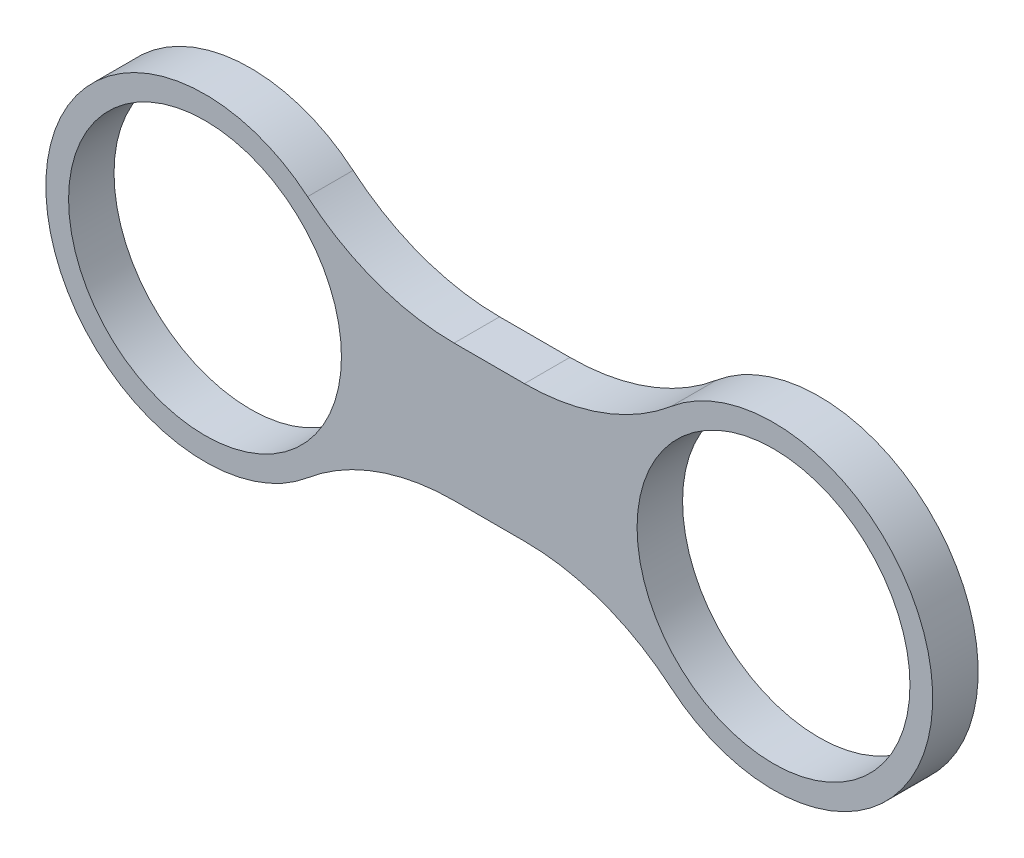
ISO-10303-21;
HEADER;
FILE_DESCRIPTION(('STEP AP214'),'2;1');
FILE_NAME('part.step','',(''),(''),'','','');
FILE_SCHEMA(('AUTOMOTIVE_DESIGN { 1 0 10303 214 1 1 1 1 }'));
ENDSEC;
DATA;
#1=APPLICATION_CONTEXT('core data for automotive mechanical design processes');
#2=APPLICATION_PROTOCOL_DEFINITION('international standard','automotive_design',2000,#1);
#3=PRODUCT_CONTEXT('',#1,'mechanical');
#4=PRODUCT('Part','Part','',(#3));
#5=PRODUCT_RELATED_PRODUCT_CATEGORY('part','',(#4));
#6=PRODUCT_DEFINITION_FORMATION('','',#4);
#7=PRODUCT_DEFINITION_CONTEXT('part definition',#1,'design');
#8=PRODUCT_DEFINITION('design','',#6,#7);
#9=PRODUCT_DEFINITION_SHAPE('','',#8);
#10=(LENGTH_UNIT() NAMED_UNIT(*) SI_UNIT(.MILLI.,.METRE.));
#11=(NAMED_UNIT(*) PLANE_ANGLE_UNIT() SI_UNIT($,.RADIAN.));
#12=(NAMED_UNIT(*) SI_UNIT($,.STERADIAN.) SOLID_ANGLE_UNIT());
#13=UNCERTAINTY_MEASURE_WITH_UNIT(LENGTH_MEASURE(1.E-05),#10,'distance_accuracy_value','');
#14=(GEOMETRIC_REPRESENTATION_CONTEXT(3) GLOBAL_UNCERTAINTY_ASSIGNED_CONTEXT((#13)) GLOBAL_UNIT_ASSIGNED_CONTEXT((#10,
#11,#12)) REPRESENTATION_CONTEXT('',''));
#15=CARTESIAN_POINT('',(0.,0.,0.));
#16=DIRECTION('',(0.,0.,1.));
#17=DIRECTION('',(1.,0.,0.));
#18=AXIS2_PLACEMENT_3D('',#15,#16,#17);
#19=CARTESIAN_POINT('',(-12.5,0.,2.));
#20=DIRECTION('',(0.,0.,-1.));
#21=DIRECTION('',(-1.,0.,0.));
#22=AXIS2_PLACEMENT_3D('',#19,#20,#21);
#23=CYLINDRICAL_SURFACE('',#22,7.);
#24=CARTESIAN_POINT('',(-12.5,0.,0.));
#25=DIRECTION('',(0.,0.,1.));
#26=DIRECTION('',(1.,0.,0.));
#27=AXIS2_PLACEMENT_3D('',#24,#25,#26);
#28=CIRCLE('',#27,7.);
#29=CARTESIAN_POINT('',(-7.9893436440751,5.35294117647059,0.));
#30=VERTEX_POINT('',#29);
#31=CARTESIAN_POINT('',(-7.9893436440751,-5.35294117647059,0.));
#32=VERTEX_POINT('',#31);
#33=EDGE_CURVE('E112',#30,#32,#28,.T.);
#34=ORIENTED_EDGE('',*,*,#33,.T.);
#35=DIRECTION('',(0.,0.,-1.));
#36=VECTOR('',#35,1.);
#37=CARTESIAN_POINT('',(-7.9893436440751,-5.35294117647059,2.));
#38=LINE('',#37,#36);
#39=CARTESIAN_POINT('',(-7.9893436440751,-5.35294117647059,2.));
#40=VERTEX_POINT('',#39);
#41=EDGE_CURVE('E58',#32,#40,#38,.F.);
#42=ORIENTED_EDGE('',*,*,#41,.T.);
#43=CARTESIAN_POINT('',(-12.5,0.,2.));
#44=DIRECTION('',(0.,0.,1.));
#45=DIRECTION('',(1.,0.,0.));
#46=AXIS2_PLACEMENT_3D('',#43,#44,#45);
#47=CIRCLE('',#46,7.);
#48=CARTESIAN_POINT('',(-7.9893436440751,5.35294117647059,2.));
#49=VERTEX_POINT('',#48);
#50=EDGE_CURVE('E166',#49,#40,#47,.T.);
#51=ORIENTED_EDGE('',*,*,#50,.F.);
#52=DIRECTION('',(0.,0.,-1.));
#53=VECTOR('',#52,1.);
#54=CARTESIAN_POINT('',(-7.9893436440751,5.35294117647059,2.));
#55=LINE('',#54,#53);
#56=EDGE_CURVE('E146',#49,#30,#55,.T.);
#57=ORIENTED_EDGE('',*,*,#56,.T.);
#58=EDGE_LOOP('',(#34,#42,#51,#57));
#59=FACE_BOUND('',#58,.T.);
#60=ADVANCED_FACE('F43',(#59),#23,.T.);
#61=CARTESIAN_POINT('',(0.,-3.,2.));
#62=DIRECTION('',(0.,1.,0.));
#63=DIRECTION('',(0.,0.,1.));
#64=AXIS2_PLACEMENT_3D('',#61,#62,#63);
#65=PLANE('',#64);
#66=DIRECTION('',(1.,0.,0.));
#67=VECTOR('',#66,1.);
#68=CARTESIAN_POINT('',(0.,-3.,0.));
#69=LINE('',#68,#67);
#70=CARTESIAN_POINT('',(-1.54554884989668,-3.,0.));
#71=VERTEX_POINT('',#70);
#72=CARTESIAN_POINT('',(1.54554884989668,-3.,0.));
#73=VERTEX_POINT('',#72);
#74=EDGE_CURVE('E177',#71,#73,#69,.T.);
#75=ORIENTED_EDGE('',*,*,#74,.T.);
#76=DIRECTION('',(0.,0.,1.));
#77=VECTOR('',#76,1.);
#78=CARTESIAN_POINT('',(1.54554884989668,-3.,2.));
#79=LINE('',#78,#77);
#80=CARTESIAN_POINT('',(1.54554884989668,-3.,2.));
#81=VERTEX_POINT('',#80);
#82=EDGE_CURVE('E144',#73,#81,#79,.T.);
#83=ORIENTED_EDGE('',*,*,#82,.T.);
#84=DIRECTION('',(1.,0.,0.));
#85=VECTOR('',#84,1.);
#86=CARTESIAN_POINT('',(0.,-3.,2.));
#87=LINE('',#86,#85);
#88=CARTESIAN_POINT('',(-1.54554884989668,-3.,2.));
#89=VERTEX_POINT('',#88);
#90=EDGE_CURVE('E164',#89,#81,#87,.T.);
#91=ORIENTED_EDGE('',*,*,#90,.F.);
#92=DIRECTION('',(0.,0.,1.));
#93=VECTOR('',#92,1.);
#94=CARTESIAN_POINT('',(-1.54554884989668,-3.,0.));
#95=LINE('',#94,#93);
#96=EDGE_CURVE('E141',#89,#71,#95,.F.);
#97=ORIENTED_EDGE('',*,*,#96,.T.);
#98=EDGE_LOOP('',(#75,#83,#91,#97));
#99=FACE_BOUND('',#98,.T.);
#100=ADVANCED_FACE('F171',(#99),#65,.F.);
#101=CARTESIAN_POINT('',(12.5,0.,2.));
#102=DIRECTION('',(0.,0.,-1.));
#103=DIRECTION('',(-1.,0.,0.));
#104=AXIS2_PLACEMENT_3D('',#101,#102,#103);
#105=CYLINDRICAL_SURFACE('',#104,7.);
#106=CARTESIAN_POINT('',(12.5,0.,0.));
#107=DIRECTION('',(0.,0.,1.));
#108=DIRECTION('',(1.,0.,0.));
#109=AXIS2_PLACEMENT_3D('',#106,#107,#108);
#110=CIRCLE('',#109,7.);
#111=CARTESIAN_POINT('',(7.9893436440751,-5.35294117647059,0.));
#112=VERTEX_POINT('',#111);
#113=CARTESIAN_POINT('',(7.9893436440751,5.35294117647059,0.));
#114=VERTEX_POINT('',#113);
#115=EDGE_CURVE('E126',#112,#114,#110,.T.);
#116=ORIENTED_EDGE('',*,*,#115,.T.);
#117=DIRECTION('',(0.,0.,-1.));
#118=VECTOR('',#117,1.);
#119=CARTESIAN_POINT('',(7.9893436440751,5.35294117647059,2.));
#120=LINE('',#119,#118);
#121=CARTESIAN_POINT('',(7.9893436440751,5.35294117647059,2.));
#122=VERTEX_POINT('',#121);
#123=EDGE_CURVE('E139',#114,#122,#120,.F.);
#124=ORIENTED_EDGE('',*,*,#123,.T.);
#125=CARTESIAN_POINT('',(12.5,0.,2.));
#126=DIRECTION('',(0.,0.,1.));
#127=DIRECTION('',(1.,0.,0.));
#128=AXIS2_PLACEMENT_3D('',#125,#126,#127);
#129=CIRCLE('',#128,7.);
#130=CARTESIAN_POINT('',(7.9893436440751,-5.35294117647059,2.));
#131=VERTEX_POINT('',#130);
#132=EDGE_CURVE('E174',#131,#122,#129,.T.);
#133=ORIENTED_EDGE('',*,*,#132,.F.);
#134=DIRECTION('',(0.,0.,-1.));
#135=VECTOR('',#134,1.);
#136=CARTESIAN_POINT('',(7.9893436440751,-5.35294117647059,2.));
#137=LINE('',#136,#135);
#138=EDGE_CURVE('E130',#131,#112,#137,.T.);
#139=ORIENTED_EDGE('',*,*,#138,.T.);
#140=EDGE_LOOP('',(#116,#124,#133,#139));
#141=FACE_BOUND('',#140,.T.);
#142=ADVANCED_FACE('F188',(#141),#105,.T.);
#143=CARTESIAN_POINT('',(0.,3.,2.));
#144=DIRECTION('',(0.,1.,0.));
#145=DIRECTION('',(0.,0.,1.));
#146=AXIS2_PLACEMENT_3D('',#143,#144,#145);
#147=PLANE('',#146);
#148=DIRECTION('',(1.,0.,0.));
#149=VECTOR('',#148,1.);
#150=CARTESIAN_POINT('',(0.,3.,2.));
#151=LINE('',#150,#149);
#152=CARTESIAN_POINT('',(-1.54554884989668,3.,2.));
#153=VERTEX_POINT('',#152);
#154=CARTESIAN_POINT('',(1.54554884989668,3.,2.));
#155=VERTEX_POINT('',#154);
#156=EDGE_CURVE('E133',#153,#155,#151,.T.);
#157=ORIENTED_EDGE('',*,*,#156,.T.);
#158=DIRECTION('',(0.,0.,-1.));
#159=VECTOR('',#158,1.);
#160=CARTESIAN_POINT('',(1.54554884989668,3.,2.));
#161=LINE('',#160,#159);
#162=CARTESIAN_POINT('',(1.54554884989668,3.,0.));
#163=VERTEX_POINT('',#162);
#164=EDGE_CURVE('E124',#155,#163,#161,.T.);
#165=ORIENTED_EDGE('',*,*,#164,.T.);
#166=DIRECTION('',(1.,0.,0.));
#167=VECTOR('',#166,1.);
#168=CARTESIAN_POINT('',(0.,3.,0.));
#169=LINE('',#168,#167);
#170=CARTESIAN_POINT('',(-1.54554884989668,3.,0.));
#171=VERTEX_POINT('',#170);
#172=EDGE_CURVE('E111',#171,#163,#169,.T.);
#173=ORIENTED_EDGE('',*,*,#172,.F.);
#174=DIRECTION('',(0.,0.,-1.));
#175=VECTOR('',#174,1.);
#176=CARTESIAN_POINT('',(-1.54554884989668,3.,2.));
#177=LINE('',#176,#175);
#178=EDGE_CURVE('E122',#171,#153,#177,.F.);
#179=ORIENTED_EDGE('',*,*,#178,.T.);
#180=EDGE_LOOP('',(#157,#165,#173,#179));
#181=FACE_BOUND('',#180,.T.);
#182=ADVANCED_FACE('F121',(#181),#147,.T.);
#183=CARTESIAN_POINT('',(12.5,0.,2.));
#184=DIRECTION('',(0.,0.,-1.));
#185=DIRECTION('',(-1.,0.,0.));
#186=AXIS2_PLACEMENT_3D('',#183,#184,#185);
#187=CYLINDRICAL_SURFACE('',#186,6.);
#188=CARTESIAN_POINT('',(12.5,0.,2.));
#189=DIRECTION('',(0.,0.,1.));
#190=DIRECTION('',(1.,0.,0.));
#191=AXIS2_PLACEMENT_3D('',#188,#189,#190);
#192=CIRCLE('',#191,6.);
#193=CARTESIAN_POINT('',(18.5,0.,2.));
#194=VERTEX_POINT('',#193);
#195=EDGE_CURVE('E199',#194,#194,#192,.T.);
#196=ORIENTED_EDGE('',*,*,#195,.T.);
#197=EDGE_LOOP('',(#196));
#198=FACE_BOUND('',#197,.T.);
#199=CARTESIAN_POINT('',(12.5,0.,0.));
#200=DIRECTION('',(0.,0.,1.));
#201=DIRECTION('',(1.,0.,0.));
#202=AXIS2_PLACEMENT_3D('',#199,#200,#201);
#203=CIRCLE('',#202,6.);
#204=CARTESIAN_POINT('',(18.5,0.,0.));
#205=VERTEX_POINT('',#204);
#206=EDGE_CURVE('E178',#205,#205,#203,.T.);
#207=ORIENTED_EDGE('',*,*,#206,.F.);
#208=EDGE_LOOP('',(#207));
#209=FACE_BOUND('',#208,.T.);
#210=ADVANCED_FACE('F208',(#198,#209),#187,.F.);
#211=CARTESIAN_POINT('',(-12.5,0.,2.));
#212=DIRECTION('',(0.,0.,-1.));
#213=DIRECTION('',(-1.,0.,0.));
#214=AXIS2_PLACEMENT_3D('',#211,#212,#213);
#215=CYLINDRICAL_SURFACE('',#214,6.);
#216=CARTESIAN_POINT('',(-12.5,0.,2.));
#217=DIRECTION('',(0.,0.,1.));
#218=DIRECTION('',(1.,0.,0.));
#219=AXIS2_PLACEMENT_3D('',#216,#217,#218);
#220=CIRCLE('',#219,6.);
#221=CARTESIAN_POINT('',(-6.5,0.,2.));
#222=VERTEX_POINT('',#221);
#223=EDGE_CURVE('E128',#222,#222,#220,.T.);
#224=ORIENTED_EDGE('',*,*,#223,.T.);
#225=EDGE_LOOP('',(#224));
#226=FACE_BOUND('',#225,.T.);
#227=CARTESIAN_POINT('',(-12.5,0.,0.));
#228=DIRECTION('',(0.,0.,1.));
#229=DIRECTION('',(1.,0.,0.));
#230=AXIS2_PLACEMENT_3D('',#227,#228,#229);
#231=CIRCLE('',#230,6.);
#232=CARTESIAN_POINT('',(-6.5,0.,0.));
#233=VERTEX_POINT('',#232);
#234=EDGE_CURVE('E125',#233,#233,#231,.T.);
#235=ORIENTED_EDGE('',*,*,#234,.F.);
#236=EDGE_LOOP('',(#235));
#237=FACE_BOUND('',#236,.T.);
#238=ADVANCED_FACE('F206',(#226,#237),#215,.F.);
#239=CARTESIAN_POINT('',(0.,0.,2.));
#240=DIRECTION('',(0.,0.,1.));
#241=DIRECTION('',(1.,0.,0.));
#242=AXIS2_PLACEMENT_3D('',#239,#240,#241);
#243=PLANE('',#242);
#244=ORIENTED_EDGE('',*,*,#195,.F.);
#245=EDGE_LOOP('',(#244));
#246=FACE_BOUND('',#245,.T.);
#247=ORIENTED_EDGE('',*,*,#156,.F.);
#248=CARTESIAN_POINT('',(-1.54554884989668,13.,2.));
#249=DIRECTION('',(0.,0.,1.));
#250=DIRECTION('',(1.,0.,0.));
#251=AXIS2_PLACEMENT_3D('',#248,#249,#250);
#252=CIRCLE('',#251,10.);
#253=EDGE_CURVE('E11',#153,#49,#252,.F.);
#254=ORIENTED_EDGE('',*,*,#253,.T.);
#255=ORIENTED_EDGE('',*,*,#50,.T.);
#256=CARTESIAN_POINT('',(-1.54554884989668,-13.,2.));
#257=DIRECTION('',(0.,0.,1.));
#258=DIRECTION('',(1.,0.,0.));
#259=AXIS2_PLACEMENT_3D('',#256,#257,#258);
#260=CIRCLE('',#259,10.);
#261=EDGE_CURVE('E117',#40,#89,#260,.F.);
#262=ORIENTED_EDGE('',*,*,#261,.T.);
#263=ORIENTED_EDGE('',*,*,#90,.T.);
#264=CARTESIAN_POINT('',(1.54554884989668,-13.,2.));
#265=DIRECTION('',(0.,0.,1.));
#266=DIRECTION('',(1.,0.,0.));
#267=AXIS2_PLACEMENT_3D('',#264,#265,#266);
#268=CIRCLE('',#267,10.);
#269=EDGE_CURVE('E155',#81,#131,#268,.F.);
#270=ORIENTED_EDGE('',*,*,#269,.T.);
#271=ORIENTED_EDGE('',*,*,#132,.T.);
#272=CARTESIAN_POINT('',(1.54554884989668,13.,2.));
#273=DIRECTION('',(0.,0.,1.));
#274=DIRECTION('',(1.,0.,0.));
#275=AXIS2_PLACEMENT_3D('',#272,#273,#274);
#276=CIRCLE('',#275,10.);
#277=EDGE_CURVE('E151',#122,#155,#276,.F.);
#278=ORIENTED_EDGE('',*,*,#277,.T.);
#279=EDGE_LOOP('',(#247,#254,#255,#262,#263,#270,#271,#278));
#280=FACE_BOUND('',#279,.T.);
#281=ORIENTED_EDGE('',*,*,#223,.F.);
#282=EDGE_LOOP('',(#281));
#283=FACE_BOUND('',#282,.T.);
#284=ADVANCED_FACE('F162',(#246,#280,#283),#243,.T.);
#285=CARTESIAN_POINT('',(0.,0.,0.));
#286=DIRECTION('',(0.,0.,1.));
#287=DIRECTION('',(1.,0.,0.));
#288=AXIS2_PLACEMENT_3D('',#285,#286,#287);
#289=PLANE('',#288);
#290=ORIENTED_EDGE('',*,*,#206,.T.);
#291=EDGE_LOOP('',(#290));
#292=FACE_BOUND('',#291,.T.);
#293=ORIENTED_EDGE('',*,*,#33,.F.);
#294=CARTESIAN_POINT('',(-1.54554884989668,13.,0.));
#295=DIRECTION('',(0.,0.,1.));
#296=DIRECTION('',(1.,0.,0.));
#297=AXIS2_PLACEMENT_3D('',#294,#295,#296);
#298=CIRCLE('',#297,10.);
#299=EDGE_CURVE('E51',#30,#171,#298,.T.);
#300=ORIENTED_EDGE('',*,*,#299,.T.);
#301=ORIENTED_EDGE('',*,*,#172,.T.);
#302=CARTESIAN_POINT('',(1.54554884989668,13.,0.));
#303=DIRECTION('',(0.,0.,1.));
#304=DIRECTION('',(1.,0.,0.));
#305=AXIS2_PLACEMENT_3D('',#302,#303,#304);
#306=CIRCLE('',#305,10.);
#307=EDGE_CURVE('E149',#163,#114,#306,.T.);
#308=ORIENTED_EDGE('',*,*,#307,.T.);
#309=ORIENTED_EDGE('',*,*,#115,.F.);
#310=CARTESIAN_POINT('',(1.54554884989668,-13.,0.));
#311=DIRECTION('',(0.,0.,1.));
#312=DIRECTION('',(1.,0.,0.));
#313=AXIS2_PLACEMENT_3D('',#310,#311,#312);
#314=CIRCLE('',#313,10.);
#315=EDGE_CURVE('E153',#112,#73,#314,.T.);
#316=ORIENTED_EDGE('',*,*,#315,.T.);
#317=ORIENTED_EDGE('',*,*,#74,.F.);
#318=CARTESIAN_POINT('',(-1.54554884989668,-13.,0.));
#319=DIRECTION('',(0.,0.,1.));
#320=DIRECTION('',(1.,0.,0.));
#321=AXIS2_PLACEMENT_3D('',#318,#319,#320);
#322=CIRCLE('',#321,10.);
#323=EDGE_CURVE('E157',#71,#32,#322,.T.);
#324=ORIENTED_EDGE('',*,*,#323,.T.);
#325=EDGE_LOOP('',(#293,#300,#301,#308,#309,#316,#317,#324));
#326=FACE_BOUND('',#325,.T.);
#327=ORIENTED_EDGE('',*,*,#234,.T.);
#328=EDGE_LOOP('',(#327));
#329=FACE_BOUND('',#328,.T.);
#330=ADVANCED_FACE('F109',(#292,#326,#329),#289,.F.);
#331=CARTESIAN_POINT('',(1.54554884989668,13.,2.));
#332=DIRECTION('',(0.,0.,-1.));
#333=DIRECTION('',(-1.,0.,0.));
#334=AXIS2_PLACEMENT_3D('',#331,#332,#333);
#335=CYLINDRICAL_SURFACE('',#334,10.);
#336=ORIENTED_EDGE('',*,*,#277,.F.);
#337=ORIENTED_EDGE('',*,*,#123,.F.);
#338=ORIENTED_EDGE('',*,*,#307,.F.);
#339=ORIENTED_EDGE('',*,*,#164,.F.);
#340=EDGE_LOOP('',(#336,#337,#338,#339));
#341=FACE_BOUND('',#340,.T.);
#342=ADVANCED_FACE('F194',(#341),#335,.F.);
#343=CARTESIAN_POINT('',(1.54554884989668,-13.,2.));
#344=DIRECTION('',(0.,0.,-1.));
#345=DIRECTION('',(-1.,0.,0.));
#346=AXIS2_PLACEMENT_3D('',#343,#344,#345);
#347=CYLINDRICAL_SURFACE('',#346,10.);
#348=ORIENTED_EDGE('',*,*,#269,.F.);
#349=ORIENTED_EDGE('',*,*,#82,.F.);
#350=ORIENTED_EDGE('',*,*,#315,.F.);
#351=ORIENTED_EDGE('',*,*,#138,.F.);
#352=EDGE_LOOP('',(#348,#349,#350,#351));
#353=FACE_BOUND('',#352,.T.);
#354=ADVANCED_FACE('F230',(#353),#347,.F.);
#355=CARTESIAN_POINT('',(-1.54554884989668,-13.,2.));
#356=DIRECTION('',(0.,0.,-1.));
#357=DIRECTION('',(-1.,0.,0.));
#358=AXIS2_PLACEMENT_3D('',#355,#356,#357);
#359=CYLINDRICAL_SURFACE('',#358,10.);
#360=ORIENTED_EDGE('',*,*,#261,.F.);
#361=ORIENTED_EDGE('',*,*,#41,.F.);
#362=ORIENTED_EDGE('',*,*,#323,.F.);
#363=ORIENTED_EDGE('',*,*,#96,.F.);
#364=EDGE_LOOP('',(#360,#361,#362,#363));
#365=FACE_BOUND('',#364,.T.);
#366=ADVANCED_FACE('F176',(#365),#359,.F.);
#367=CARTESIAN_POINT('',(-1.54554884989668,13.,2.));
#368=DIRECTION('',(0.,0.,-1.));
#369=DIRECTION('',(-1.,0.,0.));
#370=AXIS2_PLACEMENT_3D('',#367,#368,#369);
#371=CYLINDRICAL_SURFACE('',#370,10.);
#372=ORIENTED_EDGE('',*,*,#253,.F.);
#373=ORIENTED_EDGE('',*,*,#178,.F.);
#374=ORIENTED_EDGE('',*,*,#299,.F.);
#375=ORIENTED_EDGE('',*,*,#56,.F.);
#376=EDGE_LOOP('',(#372,#373,#374,#375));
#377=FACE_BOUND('',#376,.T.);
#378=ADVANCED_FACE('F45',(#377),#371,.F.);
#379=CLOSED_SHELL('',(#60,#100,#142,#182,#210,#238,#284,#330,#342,#354,#366,#378));
#380=MANIFOLD_SOLID_BREP('B2',#379);
#381=ADVANCED_BREP_SHAPE_REPRESENTATION('',(#18,#380),#14);
#382=SHAPE_DEFINITION_REPRESENTATION(#9,#381);
ENDSEC;
END-ISO-10303-21;
